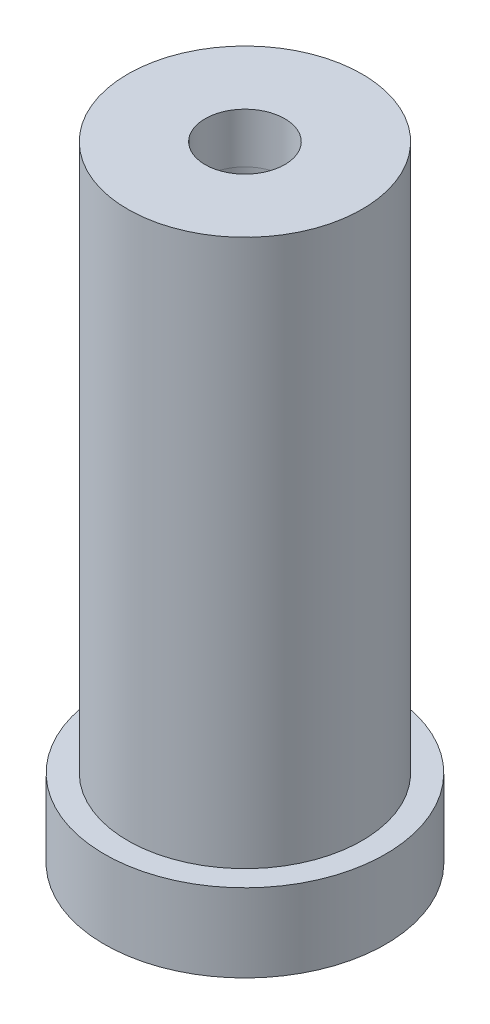
ISO-10303-21;
HEADER;
FILE_DESCRIPTION(('STEP AP214'),'2;1');
FILE_NAME('part.step','',(''),(''),'','','');
FILE_SCHEMA(('AUTOMOTIVE_DESIGN { 1 0 10303 214 1 1 1 1 }'));
ENDSEC;
DATA;
#1=APPLICATION_CONTEXT('core data for automotive mechanical design processes');
#2=APPLICATION_PROTOCOL_DEFINITION('international standard','automotive_design',2000,#1);
#3=PRODUCT_CONTEXT('',#1,'mechanical');
#4=PRODUCT('Part','Part','',(#3));
#5=PRODUCT_RELATED_PRODUCT_CATEGORY('part','',(#4));
#6=PRODUCT_DEFINITION_FORMATION('','',#4);
#7=PRODUCT_DEFINITION_CONTEXT('part definition',#1,'design');
#8=PRODUCT_DEFINITION('design','',#6,#7);
#9=PRODUCT_DEFINITION_SHAPE('','',#8);
#10=(LENGTH_UNIT() NAMED_UNIT(*) SI_UNIT(.MILLI.,.METRE.));
#11=(NAMED_UNIT(*) PLANE_ANGLE_UNIT() SI_UNIT($,.RADIAN.));
#12=(NAMED_UNIT(*) SI_UNIT($,.STERADIAN.) SOLID_ANGLE_UNIT());
#13=UNCERTAINTY_MEASURE_WITH_UNIT(LENGTH_MEASURE(1.E-05),#10,'distance_accuracy_value','');
#14=(GEOMETRIC_REPRESENTATION_CONTEXT(3) GLOBAL_UNCERTAINTY_ASSIGNED_CONTEXT((#13)) GLOBAL_UNIT_ASSIGNED_CONTEXT((#10,
#11,#12)) REPRESENTATION_CONTEXT('',''));
#15=CARTESIAN_POINT('',(0.,0.,0.));
#16=DIRECTION('',(0.,0.,1.));
#17=DIRECTION('',(1.,0.,0.));
#18=AXIS2_PLACEMENT_3D('',#15,#16,#17);
#19=CARTESIAN_POINT('',(0.,-0.001000000000001,0.));
#20=DIRECTION('',(0.,1.,0.));
#21=DIRECTION('',(0.,0.,1.));
#22=AXIS2_PLACEMENT_3D('',#19,#20,#21);
#23=CYLINDRICAL_SURFACE('',#22,2.55);
#24=CARTESIAN_POINT('',(0.,40.,0.));
#25=DIRECTION('',(0.,1.,0.));
#26=DIRECTION('',(0.,0.,1.));
#27=AXIS2_PLACEMENT_3D('',#24,#25,#26);
#28=CIRCLE('',#27,2.55);
#29=CARTESIAN_POINT('',(0.,40.,2.55));
#30=VERTEX_POINT('',#29);
#31=EDGE_CURVE('E63',#30,#30,#28,.T.);
#32=ORIENTED_EDGE('',*,*,#31,.T.);
#33=EDGE_LOOP('',(#32));
#34=FACE_BOUND('',#33,.T.);
#35=CARTESIAN_POINT('',(0.,36.8,0.));
#36=DIRECTION('',(0.,1.,0.));
#37=DIRECTION('',(1.,0.,0.));
#38=AXIS2_PLACEMENT_3D('',#35,#36,#37);
#39=CIRCLE('',#38,2.55);
#40=CARTESIAN_POINT('',(2.55,36.8,0.));
#41=VERTEX_POINT('',#40);
#42=EDGE_CURVE('E59',#41,#41,#39,.T.);
#43=ORIENTED_EDGE('',*,*,#42,.F.);
#44=EDGE_LOOP('',(#43));
#45=FACE_BOUND('',#44,.T.);
#46=ADVANCED_FACE('F41',(#34,#45),#23,.F.);
#47=CARTESIAN_POINT('',(0.,0.,0.));
#48=DIRECTION('',(0.,1.,0.));
#49=DIRECTION('',(-1.,0.,0.));
#50=AXIS2_PLACEMENT_3D('',#47,#48,#49);
#51=PLANE('',#50);
#52=CARTESIAN_POINT('',(0.,0.,0.));
#53=DIRECTION('',(0.,1.,0.));
#54=DIRECTION('',(1.,0.,0.));
#55=AXIS2_PLACEMENT_3D('',#52,#53,#54);
#56=CIRCLE('',#55,3.51364191374583);
#57=CARTESIAN_POINT('',(3.51364191374583,0.,0.));
#58=VERTEX_POINT('',#57);
#59=EDGE_CURVE('E56',#58,#58,#56,.T.);
#60=ORIENTED_EDGE('',*,*,#59,.T.);
#61=EDGE_LOOP('',(#60));
#62=FACE_BOUND('',#61,.T.);
#63=CARTESIAN_POINT('',(0.,0.,0.));
#64=DIRECTION('',(0.,1.,0.));
#65=DIRECTION('',(-1.,0.,0.));
#66=AXIS2_PLACEMENT_3D('',#63,#64,#65);
#67=CIRCLE('',#66,9.00000000000001);
#68=CARTESIAN_POINT('',(-9.00000000000001,0.,0.));
#69=VERTEX_POINT('',#68);
#70=EDGE_CURVE('E11',#69,#69,#67,.T.);
#71=ORIENTED_EDGE('',*,*,#70,.F.);
#72=EDGE_LOOP('',(#71));
#73=FACE_BOUND('',#72,.T.);
#74=ADVANCED_FACE('F43',(#62,#73),#51,.F.);
#75=CARTESIAN_POINT('',(0.,45.,0.));
#76=DIRECTION('',(0.,1.,0.));
#77=DIRECTION('',(-1.,0.,0.));
#78=AXIS2_PLACEMENT_3D('',#75,#76,#77);
#79=CYLINDRICAL_SURFACE('',#78,9.00000000000001);
#80=CARTESIAN_POINT('',(0.,5.,0.));
#81=DIRECTION('',(0.,1.,0.));
#82=DIRECTION('',(-1.,0.,0.));
#83=AXIS2_PLACEMENT_3D('',#80,#81,#82);
#84=CIRCLE('',#83,9.00000000000001);
#85=CARTESIAN_POINT('',(-9.00000000000001,5.,0.));
#86=VERTEX_POINT('',#85);
#87=EDGE_CURVE('E49',#86,#86,#84,.T.);
#88=ORIENTED_EDGE('',*,*,#87,.F.);
#89=EDGE_LOOP('',(#88));
#90=FACE_BOUND('',#89,.T.);
#91=ORIENTED_EDGE('',*,*,#70,.T.);
#92=EDGE_LOOP('',(#91));
#93=FACE_BOUND('',#92,.T.);
#94=ADVANCED_FACE('F80',(#90,#93),#79,.T.);
#95=CARTESIAN_POINT('',(9.00000000000001,5.,0.));
#96=DIRECTION('',(0.,-1.,0.));
#97=DIRECTION('',(1.,0.,0.));
#98=AXIS2_PLACEMENT_3D('',#95,#96,#97);
#99=PLANE('',#98);
#100=CARTESIAN_POINT('',(0.,5.,0.));
#101=DIRECTION('',(0.,1.,0.));
#102=DIRECTION('',(-1.,0.,0.));
#103=AXIS2_PLACEMENT_3D('',#100,#101,#102);
#104=CIRCLE('',#103,7.5);
#105=CARTESIAN_POINT('',(-7.5,5.,0.));
#106=VERTEX_POINT('',#105);
#107=EDGE_CURVE('E73',#106,#106,#104,.T.);
#108=ORIENTED_EDGE('',*,*,#107,.F.);
#109=EDGE_LOOP('',(#108));
#110=FACE_BOUND('',#109,.T.);
#111=ORIENTED_EDGE('',*,*,#87,.T.);
#112=EDGE_LOOP('',(#111));
#113=FACE_BOUND('',#112,.T.);
#114=ADVANCED_FACE('F78',(#110,#113),#99,.F.);
#115=CARTESIAN_POINT('',(0.,45.,0.));
#116=DIRECTION('',(0.,1.,0.));
#117=DIRECTION('',(-1.,0.,0.));
#118=AXIS2_PLACEMENT_3D('',#115,#116,#117);
#119=CYLINDRICAL_SURFACE('',#118,7.5);
#120=CARTESIAN_POINT('',(0.,40.,0.));
#121=DIRECTION('',(0.,1.,0.));
#122=DIRECTION('',(-1.,0.,0.));
#123=AXIS2_PLACEMENT_3D('',#120,#121,#122);
#124=CIRCLE('',#123,7.5);
#125=CARTESIAN_POINT('',(-7.50000000000001,40.,0.));
#126=VERTEX_POINT('',#125);
#127=EDGE_CURVE('E66',#126,#126,#124,.T.);
#128=ORIENTED_EDGE('',*,*,#127,.F.);
#129=EDGE_LOOP('',(#128));
#130=FACE_BOUND('',#129,.T.);
#131=ORIENTED_EDGE('',*,*,#107,.T.);
#132=EDGE_LOOP('',(#131));
#133=FACE_BOUND('',#132,.T.);
#134=ADVANCED_FACE('F100',(#130,#133),#119,.T.);
#135=CARTESIAN_POINT('',(7.5,40.,0.));
#136=DIRECTION('',(0.,-1.,0.));
#137=DIRECTION('',(1.,0.,0.));
#138=AXIS2_PLACEMENT_3D('',#135,#136,#137);
#139=PLANE('',#138);
#140=ORIENTED_EDGE('',*,*,#31,.F.);
#141=EDGE_LOOP('',(#140));
#142=FACE_BOUND('',#141,.T.);
#143=ORIENTED_EDGE('',*,*,#127,.T.);
#144=EDGE_LOOP('',(#143));
#145=FACE_BOUND('',#144,.T.);
#146=ADVANCED_FACE('F98',(#142,#145),#139,.F.);
#147=CARTESIAN_POINT('',(0.,0.,0.));
#148=DIRECTION('',(0.,-1.,0.));
#149=DIRECTION('',(1.,0.,0.));
#150=AXIS2_PLACEMENT_3D('',#147,#148,#149);
#151=CONICAL_SURFACE('',#150,3.51364191374583,0.0261799387799081);
#152=DIRECTION('',(-0.0261769483078663,0.999657324975557,0.));
#153=VECTOR('',#152,1.);
#154=CARTESIAN_POINT('',(2.55,36.8,0.));
#155=LINE('',#154,#153);
#156=EDGE_CURVE('E61',#58,#41,#155,.T.);
#157=ORIENTED_EDGE('',*,*,#156,.F.);
#158=ORIENTED_EDGE('',*,*,#59,.F.);
#159=ORIENTED_EDGE('',*,*,#156,.T.);
#160=ORIENTED_EDGE('',*,*,#42,.T.);
#161=EDGE_LOOP('',(#157,#158,#159,#160));
#162=FACE_BOUND('',#161,.T.);
#163=ADVANCED_FACE('F60',(#162),#151,.F.);
#164=CLOSED_SHELL('',(#46,#74,#94,#114,#134,#146,#163));
#165=MANIFOLD_SOLID_BREP('B2',#164);
#166=ADVANCED_BREP_SHAPE_REPRESENTATION('',(#18,#165),#14);
#167=SHAPE_DEFINITION_REPRESENTATION(#9,#166);
ENDSEC;
END-ISO-10303-21;
